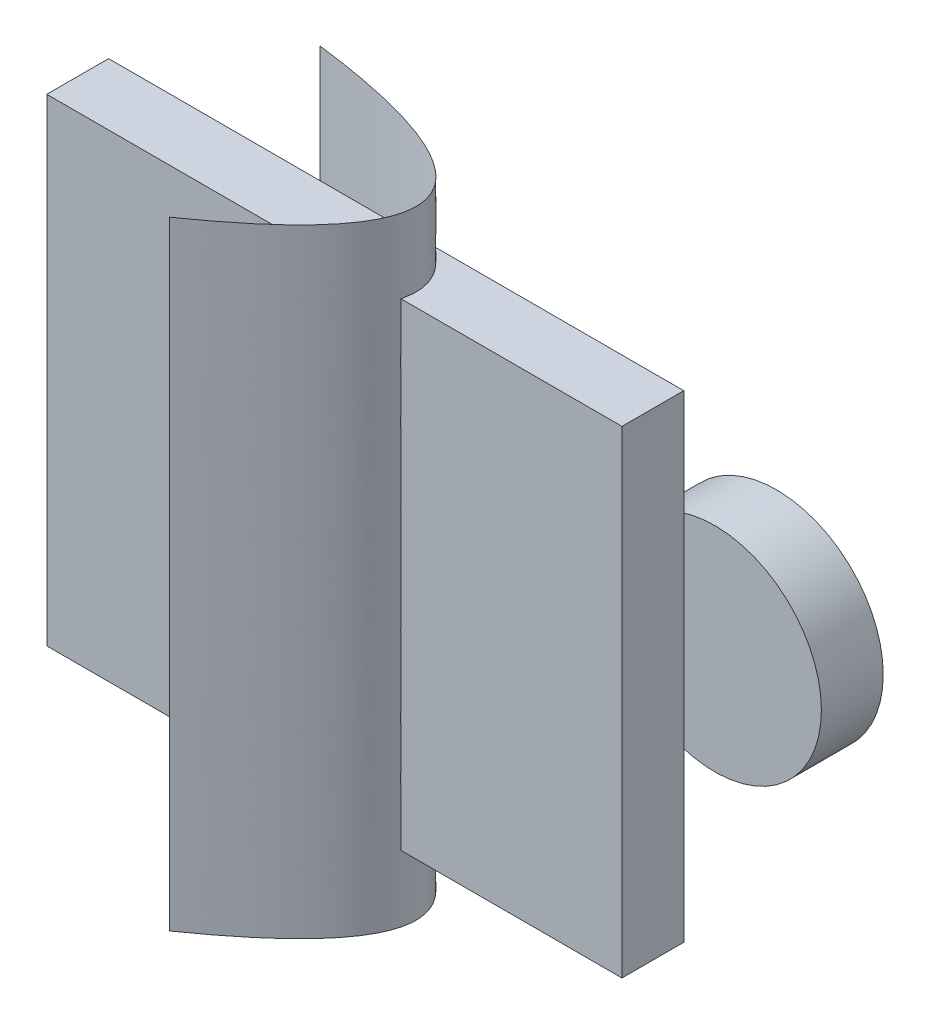
ISO-10303-21;
HEADER;
FILE_DESCRIPTION(('STEP AP214'),'2;1');
FILE_NAME('part.step','',(''),(''),'','','');
FILE_SCHEMA(('AUTOMOTIVE_DESIGN { 1 0 10303 214 1 1 1 1 }'));
ENDSEC;
DATA;
#1=APPLICATION_CONTEXT('core data for automotive mechanical design processes');
#2=APPLICATION_PROTOCOL_DEFINITION('international standard','automotive_design',2000,#1);
#3=PRODUCT_CONTEXT('',#1,'mechanical');
#4=PRODUCT('Part','Part','',(#3));
#5=PRODUCT_RELATED_PRODUCT_CATEGORY('part','',(#4));
#6=PRODUCT_DEFINITION_FORMATION('','',#4);
#7=PRODUCT_DEFINITION_CONTEXT('part definition',#1,'design');
#8=PRODUCT_DEFINITION('design','',#6,#7);
#9=PRODUCT_DEFINITION_SHAPE('','',#8);
#10=(LENGTH_UNIT() NAMED_UNIT(*) SI_UNIT(.MILLI.,.METRE.));
#11=(NAMED_UNIT(*) PLANE_ANGLE_UNIT() SI_UNIT($,.RADIAN.));
#12=(NAMED_UNIT(*) SI_UNIT($,.STERADIAN.) SOLID_ANGLE_UNIT());
#13=UNCERTAINTY_MEASURE_WITH_UNIT(LENGTH_MEASURE(1.E-05),#10,'distance_accuracy_value','');
#14=(GEOMETRIC_REPRESENTATION_CONTEXT(3) GLOBAL_UNCERTAINTY_ASSIGNED_CONTEXT((#13)) GLOBAL_UNIT_ASSIGNED_CONTEXT((#10,
#11,#12)) REPRESENTATION_CONTEXT('',''));
#15=CARTESIAN_POINT('',(0.,0.,0.));
#16=DIRECTION('',(0.,0.,1.));
#17=DIRECTION('',(1.,0.,0.));
#18=AXIS2_PLACEMENT_3D('',#15,#16,#17);
#19=CARTESIAN_POINT('',(-9.8895273624505,0.,29.2716498296639));
#20=CARTESIAN_POINT('',(32.2081101978187,0.,-0.156276991708373));
#21=CARTESIAN_POINT('',(-21.6770448247652,0.,-6.89005628353885));
#22=B_SPLINE_CURVE_WITH_KNOTS('',2,(#19,#20,#21),.UNSPECIFIED.,.F.,.F.,(3,3),(0.,1.),.UNSPECIFIED.);
#23=DIRECTION('',(0.,1.,0.));
#24=VECTOR('',#23,1.);
#25=SURFACE_OF_LINEAR_EXTRUSION('',#22,#24);
#26=DIRECTION('',(0.,1.,0.));
#27=VECTOR('',#26,1.);
#28=CARTESIAN_POINT('',(8.29260324405748,0.,10.));
#29=LINE('',#28,#27);
#30=CARTESIAN_POINT('',(8.29260324405748,-39.2569848371862,10.));
#31=VERTEX_POINT('',#30);
#32=CARTESIAN_POINT('',(8.29260324405748,38.0205443698732,10.));
#33=VERTEX_POINT('',#32);
#34=EDGE_CURVE('E89',#31,#33,#29,.T.);
#35=ORIENTED_EDGE('',*,*,#34,.F.);
#36=CARTESIAN_POINT('',(-9.8895273624505,-39.2569848371862,29.2716498296639));
#37=CARTESIAN_POINT('',(32.2081101978187,-39.2569848371862,-0.156276991708373));
#38=CARTESIAN_POINT('',(-21.6770448247652,-39.2569848371862,-6.89005628353885));
#39=B_SPLINE_CURVE_WITH_KNOTS('',2,(#36,#37,#38),.UNSPECIFIED.,.F.,.F.,(3,3),(0.,1.),.UNSPECIFIED.);
#40=CARTESIAN_POINT('',(3.39449881879197,-39.2569848371862,0.));
#41=VERTEX_POINT('',#40);
#42=EDGE_CURVE('E108',#31,#41,#39,.T.);
#43=ORIENTED_EDGE('',*,*,#42,.T.);
#44=DIRECTION('',(0.,1.,0.));
#45=VECTOR('',#44,1.);
#46=CARTESIAN_POINT('',(3.39449881879198,0.,0.));
#47=LINE('',#46,#45);
#48=CARTESIAN_POINT('',(3.39449881879197,38.0205443698732,0.));
#49=VERTEX_POINT('',#48);
#50=EDGE_CURVE('E101',#41,#49,#47,.T.);
#51=ORIENTED_EDGE('',*,*,#50,.T.);
#52=CARTESIAN_POINT('',(-9.8895273624505,38.0205443698732,29.2716498296639));
#53=CARTESIAN_POINT('',(32.2081101978187,38.0205443698732,-0.156276991708373));
#54=CARTESIAN_POINT('',(-21.6770448247652,38.0205443698732,-6.89005628353885));
#55=B_SPLINE_CURVE_WITH_KNOTS('',2,(#52,#53,#54),.UNSPECIFIED.,.F.,.F.,(3,3),(0.,1.),.UNSPECIFIED.);
#56=EDGE_CURVE('E106',#49,#33,#55,.F.);
#57=ORIENTED_EDGE('',*,*,#56,.T.);
#58=EDGE_LOOP('',(#35,#43,#51,#57));
#59=FACE_BOUND('',#58,.T.);
#60=ADVANCED_FACE('F49',(#59),#25,.T.);
#61=CARTESIAN_POINT('',(-48.9939535172757,-39.2569848371862,10.));
#62=DIRECTION('',(0.,1.,0.));
#63=DIRECTION('',(0.,0.,1.));
#64=AXIS2_PLACEMENT_3D('',#61,#62,#63);
#65=PLANE('',#64);
#66=ORIENTED_EDGE('',*,*,#42,.F.);
#67=DIRECTION('',(1.,0.,0.));
#68=VECTOR('',#67,1.);
#69=CARTESIAN_POINT('',(-48.9939535172757,-39.2569848371862,10.));
#70=LINE('',#69,#68);
#71=CARTESIAN_POINT('',(-48.9939535172757,-39.2569848371862,10.));
#72=VERTEX_POINT('',#71);
#73=EDGE_CURVE('E116',#72,#31,#70,.T.);
#74=ORIENTED_EDGE('',*,*,#73,.F.);
#75=DIRECTION('',(0.,0.,-1.));
#76=VECTOR('',#75,1.);
#77=CARTESIAN_POINT('',(-48.9939535172757,-39.2569848371862,10.));
#78=LINE('',#77,#76);
#79=CARTESIAN_POINT('',(-48.9939535172757,-39.2569848371862,0.));
#80=VERTEX_POINT('',#79);
#81=EDGE_CURVE('E122',#72,#80,#78,.T.);
#82=ORIENTED_EDGE('',*,*,#81,.T.);
#83=DIRECTION('',(1.,0.,0.));
#84=VECTOR('',#83,1.);
#85=CARTESIAN_POINT('',(-48.9939535172757,-39.2569848371862,0.));
#86=LINE('',#85,#84);
#87=EDGE_CURVE('E61',#80,#41,#86,.T.);
#88=ORIENTED_EDGE('',*,*,#87,.T.);
#89=EDGE_LOOP('',(#66,#74,#82,#88));
#90=FACE_BOUND('',#89,.T.);
#91=ADVANCED_FACE('F120',(#90),#65,.F.);
#92=CARTESIAN_POINT('',(-48.9939535172757,38.0205443698732,10.));
#93=DIRECTION('',(0.,-1.,0.));
#94=DIRECTION('',(0.,0.,-1.));
#95=AXIS2_PLACEMENT_3D('',#92,#93,#94);
#96=PLANE('',#95);
#97=ORIENTED_EDGE('',*,*,#56,.F.);
#98=DIRECTION('',(-1.,0.,0.));
#99=VECTOR('',#98,1.);
#100=CARTESIAN_POINT('',(-48.9939535172757,38.0205443698732,0.));
#101=LINE('',#100,#99);
#102=CARTESIAN_POINT('',(-48.9939535172757,38.0205443698732,0.));
#103=VERTEX_POINT('',#102);
#104=EDGE_CURVE('E97',#49,#103,#101,.T.);
#105=ORIENTED_EDGE('',*,*,#104,.T.);
#106=DIRECTION('',(0.,0.,-1.));
#107=VECTOR('',#106,1.);
#108=CARTESIAN_POINT('',(-48.9939535172757,38.0205443698732,10.));
#109=LINE('',#108,#107);
#110=CARTESIAN_POINT('',(-48.9939535172757,38.0205443698732,10.));
#111=VERTEX_POINT('',#110);
#112=EDGE_CURVE('E117',#111,#103,#109,.T.);
#113=ORIENTED_EDGE('',*,*,#112,.F.);
#114=DIRECTION('',(-1.,0.,0.));
#115=VECTOR('',#114,1.);
#116=CARTESIAN_POINT('',(-48.9939535172757,38.0205443698732,10.));
#117=LINE('',#116,#115);
#118=EDGE_CURVE('E81',#33,#111,#117,.T.);
#119=ORIENTED_EDGE('',*,*,#118,.F.);
#120=EDGE_LOOP('',(#97,#105,#113,#119));
#121=FACE_BOUND('',#120,.T.);
#122=ADVANCED_FACE('F107',(#121),#96,.F.);
#123=CARTESIAN_POINT('',(0.,0.,10.));
#124=DIRECTION('',(0.,0.,1.));
#125=DIRECTION('',(1.,0.,0.));
#126=AXIS2_PLACEMENT_3D('',#123,#124,#125);
#127=PLANE('',#126);
#128=ORIENTED_EDGE('',*,*,#73,.T.);
#129=ORIENTED_EDGE('',*,*,#34,.T.);
#130=ORIENTED_EDGE('',*,*,#118,.T.);
#131=DIRECTION('',(0.,-1.,0.));
#132=VECTOR('',#131,1.);
#133=CARTESIAN_POINT('',(-48.9939535172757,38.0205443698732,10.));
#134=LINE('',#133,#132);
#135=EDGE_CURVE('E104',#111,#72,#134,.T.);
#136=ORIENTED_EDGE('',*,*,#135,.T.);
#137=EDGE_LOOP('',(#128,#129,#130,#136));
#138=FACE_BOUND('',#137,.T.);
#139=ADVANCED_FACE('F51',(#138),#127,.T.);
#140=CARTESIAN_POINT('',(0.,0.,0.));
#141=DIRECTION('',(0.,0.,1.));
#142=DIRECTION('',(1.,0.,0.));
#143=AXIS2_PLACEMENT_3D('',#140,#141,#142);
#144=PLANE('',#143);
#145=ORIENTED_EDGE('',*,*,#50,.F.);
#146=ORIENTED_EDGE('',*,*,#87,.F.);
#147=DIRECTION('',(0.,-1.,0.));
#148=VECTOR('',#147,1.);
#149=CARTESIAN_POINT('',(-48.9939535172757,38.0205443698732,0.));
#150=LINE('',#149,#148);
#151=EDGE_CURVE('E12',#103,#80,#150,.T.);
#152=ORIENTED_EDGE('',*,*,#151,.F.);
#153=ORIENTED_EDGE('',*,*,#104,.F.);
#154=EDGE_LOOP('',(#145,#146,#152,#153));
#155=FACE_BOUND('',#154,.T.);
#156=ADVANCED_FACE('F99',(#155),#144,.F.);
#157=CARTESIAN_POINT('',(-48.9939535172757,38.0205443698732,10.));
#158=DIRECTION('',(1.,0.,0.));
#159=DIRECTION('',(0.,0.,-1.));
#160=AXIS2_PLACEMENT_3D('',#157,#158,#159);
#161=PLANE('',#160);
#162=ORIENTED_EDGE('',*,*,#151,.T.);
#163=ORIENTED_EDGE('',*,*,#81,.F.);
#164=ORIENTED_EDGE('',*,*,#135,.F.);
#165=ORIENTED_EDGE('',*,*,#112,.T.);
#166=EDGE_LOOP('',(#162,#163,#164,#165));
#167=FACE_BOUND('',#166,.T.);
#168=ADVANCED_FACE('F126',(#167),#161,.F.);
#169=CLOSED_SHELL('',(#60,#91,#122,#139,#156,#168));
#170=MANIFOLD_SOLID_BREP('B2',#169);
#171=CARTESIAN_POINT('',(-9.8895273624505,0.,29.2716498296639));
#172=CARTESIAN_POINT('',(32.2081101978187,0.,-0.156276991708373));
#173=CARTESIAN_POINT('',(-21.6770448247652,0.,-6.89005628353885));
#174=B_SPLINE_CURVE_WITH_KNOTS('',2,(#171,#172,#173),.UNSPECIFIED.,.F.,.F.,(3,3),(0.,1.),.UNSPECIFIED.);
#175=DIRECTION('',(0.,1.,0.));
#176=VECTOR('',#175,1.);
#177=SURFACE_OF_LINEAR_EXTRUSION('',#174,#176);
#178=DIRECTION('',(0.,1.,0.));
#179=VECTOR('',#178,1.);
#180=CARTESIAN_POINT('',(8.29260324405748,0.,10.));
#181=LINE('',#180,#179);
#182=CARTESIAN_POINT('',(8.29260324405748,-39.2569848371862,10.));
#183=VERTEX_POINT('',#182);
#184=CARTESIAN_POINT('',(8.29260324405748,38.0205443698732,10.));
#185=VERTEX_POINT('',#184);
#186=EDGE_CURVE('E47',#183,#185,#181,.T.);
#187=ORIENTED_EDGE('',*,*,#186,.T.);
#188=CARTESIAN_POINT('',(-9.8895273624505,38.0205443698732,29.2716498296639));
#189=CARTESIAN_POINT('',(32.2081101978187,38.0205443698732,-0.156276991708373));
#190=CARTESIAN_POINT('',(-21.6770448247652,38.0205443698732,-6.89005628353885));
#191=B_SPLINE_CURVE_WITH_KNOTS('',2,(#188,#189,#190),.UNSPECIFIED.,.F.,.F.,(3,3),(0.,1.),.UNSPECIFIED.);
#192=CARTESIAN_POINT('',(3.39449881879197,38.0205443698732,0.));
#193=VERTEX_POINT('',#192);
#194=EDGE_CURVE('E220',#193,#185,#191,.F.);
#195=ORIENTED_EDGE('',*,*,#194,.F.);
#196=DIRECTION('',(0.,1.,0.));
#197=VECTOR('',#196,1.);
#198=CARTESIAN_POINT('',(3.39449881879198,0.,0.));
#199=LINE('',#198,#197);
#200=CARTESIAN_POINT('',(3.39449881879197,-39.2569848371862,0.));
#201=VERTEX_POINT('',#200);
#202=EDGE_CURVE('E256',#201,#193,#199,.T.);
#203=ORIENTED_EDGE('',*,*,#202,.F.);
#204=CARTESIAN_POINT('',(-9.8895273624505,-39.2569848371862,29.2716498296639));
#205=CARTESIAN_POINT('',(32.2081101978187,-39.2569848371862,-0.156276991708373));
#206=CARTESIAN_POINT('',(-21.6770448247652,-39.2569848371862,-6.89005628353885));
#207=B_SPLINE_CURVE_WITH_KNOTS('',2,(#204,#205,#206),.UNSPECIFIED.,.F.,.F.,(3,3),(0.,1.),.UNSPECIFIED.);
#208=EDGE_CURVE('E207',#183,#201,#207,.T.);
#209=ORIENTED_EDGE('',*,*,#208,.F.);
#210=EDGE_LOOP('',(#187,#195,#203,#209));
#211=FACE_BOUND('',#210,.T.);
#212=ADVANCED_FACE('F199',(#211),#177,.F.);
#213=CARTESIAN_POINT('',(44.0481916480239,38.0205443698732,10.));
#214=DIRECTION('',(-1.,0.,0.));
#215=DIRECTION('',(0.,0.,1.));
#216=AXIS2_PLACEMENT_3D('',#213,#214,#215);
#217=PLANE('',#216);
#218=DIRECTION('',(0.,1.,0.));
#219=VECTOR('',#218,1.);
#220=CARTESIAN_POINT('',(44.0481916480239,38.0205443698732,0.));
#221=LINE('',#220,#219);
#222=CARTESIAN_POINT('',(44.0481916480239,-39.2569848371862,0.));
#223=VERTEX_POINT('',#222);
#224=CARTESIAN_POINT('',(44.0481916480239,38.0205443698732,0.));
#225=VERTEX_POINT('',#224);
#226=EDGE_CURVE('E266',#223,#225,#221,.T.);
#227=ORIENTED_EDGE('',*,*,#226,.T.);
#228=DIRECTION('',(0.,0.,-1.));
#229=VECTOR('',#228,1.);
#230=CARTESIAN_POINT('',(44.0481916480239,38.0205443698732,10.));
#231=LINE('',#230,#229);
#232=CARTESIAN_POINT('',(44.0481916480239,38.0205443698732,10.));
#233=VERTEX_POINT('',#232);
#234=EDGE_CURVE('E257',#233,#225,#231,.T.);
#235=ORIENTED_EDGE('',*,*,#234,.F.);
#236=DIRECTION('',(0.,1.,0.));
#237=VECTOR('',#236,1.);
#238=CARTESIAN_POINT('',(44.0481916480239,38.0205443698732,10.));
#239=LINE('',#238,#237);
#240=CARTESIAN_POINT('',(44.0481916480239,-39.2569848371862,10.));
#241=VERTEX_POINT('',#240);
#242=EDGE_CURVE('E244',#241,#233,#239,.T.);
#243=ORIENTED_EDGE('',*,*,#242,.F.);
#244=DIRECTION('',(0.,0.,-1.));
#245=VECTOR('',#244,1.);
#246=CARTESIAN_POINT('',(44.0481916480239,-39.2569848371862,10.));
#247=LINE('',#246,#245);
#248=EDGE_CURVE('E250',#241,#223,#247,.T.);
#249=ORIENTED_EDGE('',*,*,#248,.T.);
#250=EDGE_LOOP('',(#227,#235,#243,#249));
#251=FACE_BOUND('',#250,.T.);
#252=ADVANCED_FACE('F259',(#251),#217,.F.);
#253=CARTESIAN_POINT('',(-48.9939535172757,38.0205443698732,10.));
#254=DIRECTION('',(0.,-1.,0.));
#255=DIRECTION('',(0.,0.,-1.));
#256=AXIS2_PLACEMENT_3D('',#253,#254,#255);
#257=PLANE('',#256);
#258=DIRECTION('',(-1.,0.,0.));
#259=VECTOR('',#258,1.);
#260=CARTESIAN_POINT('',(-48.9939535172757,38.0205443698732,0.));
#261=LINE('',#260,#259);
#262=EDGE_CURVE('E247',#225,#193,#261,.T.);
#263=ORIENTED_EDGE('',*,*,#262,.T.);
#264=ORIENTED_EDGE('',*,*,#194,.T.);
#265=DIRECTION('',(-1.,0.,0.));
#266=VECTOR('',#265,1.);
#267=CARTESIAN_POINT('',(-48.9939535172757,38.0205443698732,10.));
#268=LINE('',#267,#266);
#269=EDGE_CURVE('E261',#233,#185,#268,.T.);
#270=ORIENTED_EDGE('',*,*,#269,.F.);
#271=ORIENTED_EDGE('',*,*,#234,.T.);
#272=EDGE_LOOP('',(#263,#264,#270,#271));
#273=FACE_BOUND('',#272,.T.);
#274=ADVANCED_FACE('F290',(#273),#257,.F.);
#275=CARTESIAN_POINT('',(-48.9939535172757,-39.2569848371862,10.));
#276=DIRECTION('',(0.,1.,0.));
#277=DIRECTION('',(0.,0.,1.));
#278=AXIS2_PLACEMENT_3D('',#275,#276,#277);
#279=PLANE('',#278);
#280=DIRECTION('',(1.,0.,0.));
#281=VECTOR('',#280,1.);
#282=CARTESIAN_POINT('',(-48.9939535172757,-39.2569848371862,10.));
#283=LINE('',#282,#281);
#284=EDGE_CURVE('E239',#183,#241,#283,.T.);
#285=ORIENTED_EDGE('',*,*,#284,.F.);
#286=ORIENTED_EDGE('',*,*,#208,.T.);
#287=DIRECTION('',(1.,0.,0.));
#288=VECTOR('',#287,1.);
#289=CARTESIAN_POINT('',(-48.9939535172757,-39.2569848371862,0.));
#290=LINE('',#289,#288);
#291=EDGE_CURVE('E253',#201,#223,#290,.T.);
#292=ORIENTED_EDGE('',*,*,#291,.T.);
#293=ORIENTED_EDGE('',*,*,#248,.F.);
#294=EDGE_LOOP('',(#285,#286,#292,#293));
#295=FACE_BOUND('',#294,.T.);
#296=ADVANCED_FACE('F251',(#295),#279,.F.);
#297=CARTESIAN_POINT('',(0.,0.,0.));
#298=DIRECTION('',(0.,0.,1.));
#299=DIRECTION('',(1.,0.,0.));
#300=AXIS2_PLACEMENT_3D('',#297,#298,#299);
#301=PLANE('',#300);
#302=ORIENTED_EDGE('',*,*,#291,.F.);
#303=ORIENTED_EDGE('',*,*,#202,.T.);
#304=ORIENTED_EDGE('',*,*,#262,.F.);
#305=ORIENTED_EDGE('',*,*,#226,.F.);
#306=EDGE_LOOP('',(#302,#303,#304,#305));
#307=FACE_BOUND('',#306,.T.);
#308=ADVANCED_FACE('F289',(#307),#301,.F.);
#309=CARTESIAN_POINT('',(0.,0.,10.));
#310=DIRECTION('',(0.,0.,1.));
#311=DIRECTION('',(1.,0.,0.));
#312=AXIS2_PLACEMENT_3D('',#309,#310,#311);
#313=PLANE('',#312);
#314=ORIENTED_EDGE('',*,*,#186,.F.);
#315=ORIENTED_EDGE('',*,*,#284,.T.);
#316=ORIENTED_EDGE('',*,*,#242,.T.);
#317=ORIENTED_EDGE('',*,*,#269,.T.);
#318=EDGE_LOOP('',(#314,#315,#316,#317));
#319=FACE_BOUND('',#318,.T.);
#320=ADVANCED_FACE('F241',(#319),#313,.T.);
#321=CLOSED_SHELL('',(#212,#252,#274,#296,#308,#320));
#322=MANIFOLD_SOLID_BREP('B6',#321);
#323=CARTESIAN_POINT('',(-9.8895273624505,0.,29.2716498296639));
#324=CARTESIAN_POINT('',(32.2081101978187,0.,-0.156276991708373));
#325=CARTESIAN_POINT('',(-21.6770448247652,0.,-6.89005628353885));
#326=B_SPLINE_CURVE_WITH_KNOTS('',2,(#323,#324,#325),.UNSPECIFIED.,.F.,.F.,(3,3),(0.,1.),.UNSPECIFIED.);
#327=DIRECTION('',(0.,1.,0.));
#328=VECTOR('',#327,1.);
#329=SURFACE_OF_LINEAR_EXTRUSION('',#326,#328);
#330=CARTESIAN_POINT('',(-9.8895273624505,50.,29.2716498296639));
#331=CARTESIAN_POINT('',(32.2081101978187,50.,-0.156276991708373));
#332=CARTESIAN_POINT('',(-21.6770448247652,50.,-6.89005628353885));
#333=B_SPLINE_CURVE_WITH_KNOTS('',2,(#330,#331,#332),.UNSPECIFIED.,.F.,.F.,(3,3),(0.,1.),.UNSPECIFIED.);
#334=CARTESIAN_POINT('',(-9.8895273624505,50.,29.2716498296639));
#335=VERTEX_POINT('',#334);
#336=CARTESIAN_POINT('',(-21.6770448247652,50.,-6.89005628353885));
#337=VERTEX_POINT('',#336);
#338=EDGE_CURVE('E356',#335,#337,#333,.T.);
#339=ORIENTED_EDGE('',*,*,#338,.F.);
#340=DIRECTION('',(0.,1.,0.));
#341=VECTOR('',#340,1.);
#342=CARTESIAN_POINT('',(-9.8895273624505,0.,29.2716498296639));
#343=LINE('',#342,#341);
#344=CARTESIAN_POINT('',(-9.8895273624505,-50.,29.2716498296639));
#345=VERTEX_POINT('',#344);
#346=EDGE_CURVE('E348',#345,#335,#343,.T.);
#347=ORIENTED_EDGE('',*,*,#346,.F.);
#348=CARTESIAN_POINT('',(-9.8895273624505,-50.,29.2716498296639));
#349=CARTESIAN_POINT('',(32.2081101978187,-50.,-0.156276991708373));
#350=CARTESIAN_POINT('',(-21.6770448247652,-50.,-6.89005628353885));
#351=B_SPLINE_CURVE_WITH_KNOTS('',2,(#348,#349,#350),.UNSPECIFIED.,.F.,.F.,(3,3),(0.,1.),.UNSPECIFIED.);
#352=CARTESIAN_POINT('',(-21.6770448247652,-50.,-6.89005628353885));
#353=VERTEX_POINT('',#352);
#354=EDGE_CURVE('E366',#345,#353,#351,.T.);
#355=ORIENTED_EDGE('',*,*,#354,.T.);
#356=DIRECTION('',(0.,1.,0.));
#357=VECTOR('',#356,1.);
#358=CARTESIAN_POINT('',(-21.6770448247652,0.,-6.89005628353885));
#359=LINE('',#358,#357);
#360=EDGE_CURVE('E197',#353,#337,#359,.T.);
#361=ORIENTED_EDGE('',*,*,#360,.T.);
#362=EDGE_LOOP('',(#339,#347,#355,#361));
#363=FACE_BOUND('',#362,.T.);
#364=ADVANCED_FACE('F346',(#363),#329,.T.);
#365=OPEN_SHELL('',(#364));
#366=SHELL_BASED_SURFACE_MODEL('B41',(#365));
#367=CARTESIAN_POINT('',(44.0481916480239,-0.618220233656479,-15.));
#368=DIRECTION('',(0.,0.,1.));
#369=DIRECTION('',(1.,0.,0.));
#370=AXIS2_PLACEMENT_3D('',#367,#368,#369);
#371=CYLINDRICAL_SURFACE('',#370,17.2617733123611);
#372=CARTESIAN_POINT('',(44.0481916480239,-0.618220233656479,-15.));
#373=DIRECTION('',(0.,0.,1.));
#374=DIRECTION('',(1.,0.,0.));
#375=AXIS2_PLACEMENT_3D('',#372,#373,#374);
#376=CIRCLE('',#375,17.2617733123611);
#377=CARTESIAN_POINT('',(61.309964960385,-0.618220233656479,-15.));
#378=VERTEX_POINT('',#377);
#379=EDGE_CURVE('E345',#378,#378,#376,.T.);
#380=ORIENTED_EDGE('',*,*,#379,.T.);
#381=EDGE_LOOP('',(#380));
#382=FACE_BOUND('',#381,.T.);
#383=CARTESIAN_POINT('',(44.0481916480239,-0.618220233656479,-5.));
#384=DIRECTION('',(0.,0.,1.));
#385=DIRECTION('',(1.,0.,0.));
#386=AXIS2_PLACEMENT_3D('',#383,#384,#385);
#387=CIRCLE('',#386,17.2617733123611);
#388=CARTESIAN_POINT('',(61.309964960385,-0.618220233656479,-5.));
#389=VERTEX_POINT('',#388);
#390=EDGE_CURVE('E409',#389,#389,#387,.T.);
#391=ORIENTED_EDGE('',*,*,#390,.F.);
#392=EDGE_LOOP('',(#391));
#393=FACE_BOUND('',#392,.T.);
#394=ADVANCED_FACE('F406',(#382,#393),#371,.T.);
#395=CARTESIAN_POINT('',(44.0481916480239,-0.618220233656479,-15.));
#396=DIRECTION('',(0.,0.,1.));
#397=DIRECTION('',(1.,0.,0.));
#398=AXIS2_PLACEMENT_3D('',#395,#396,#397);
#399=PLANE('',#398);
#400=ORIENTED_EDGE('',*,*,#379,.F.);
#401=EDGE_LOOP('',(#400));
#402=FACE_BOUND('',#401,.T.);
#403=ADVANCED_FACE('F421',(#402),#399,.F.);
#404=CARTESIAN_POINT('',(44.0481916480239,-0.618220233656479,-5.));
#405=DIRECTION('',(0.,0.,1.));
#406=DIRECTION('',(1.,0.,0.));
#407=AXIS2_PLACEMENT_3D('',#404,#405,#406);
#408=PLANE('',#407);
#409=ORIENTED_EDGE('',*,*,#390,.T.);
#410=EDGE_LOOP('',(#409));
#411=FACE_BOUND('',#410,.T.);
#412=ADVANCED_FACE('F418',(#411),#408,.T.);
#413=CLOSED_SHELL('',(#394,#403,#412));
#414=MANIFOLD_SOLID_BREP('B191',#413);
#415=ADVANCED_BREP_SHAPE_REPRESENTATION('',(#18,#170,#322,#414),#14);
#416=MANIFOLD_SURFACE_SHAPE_REPRESENTATION('',(#18,#366),#14);
#417=SHAPE_REPRESENTATION('',(#18),#14);
#418=SHAPE_DEFINITION_REPRESENTATION(#9,#417);
#419=SHAPE_REPRESENTATION_RELATIONSHIP('','',#417,#415);
#420=SHAPE_REPRESENTATION_RELATIONSHIP('','',#417,#416);
ENDSEC;
END-ISO-10303-21;
